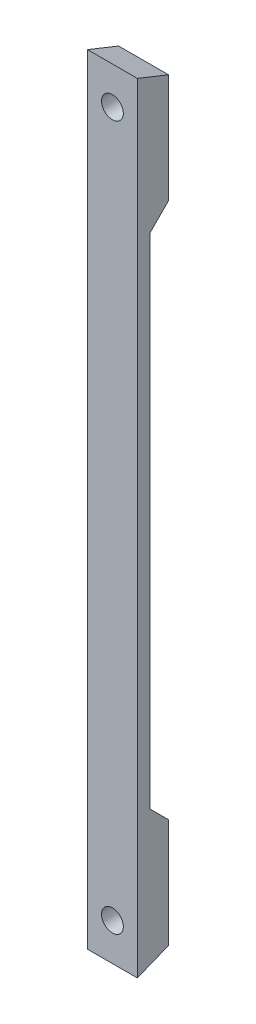
ISO-10303-21;
HEADER;
FILE_DESCRIPTION(('STEP AP214'),'2;1');
FILE_NAME('part.step','',(''),(''),'','','');
FILE_SCHEMA(('AUTOMOTIVE_DESIGN { 1 0 10303 214 1 1 1 1 }'));
ENDSEC;
DATA;
#1=APPLICATION_CONTEXT('core data for automotive mechanical design processes');
#2=APPLICATION_PROTOCOL_DEFINITION('international standard','automotive_design',2000,#1);
#3=PRODUCT_CONTEXT('',#1,'mechanical');
#4=PRODUCT('Part','Part','',(#3));
#5=PRODUCT_RELATED_PRODUCT_CATEGORY('part','',(#4));
#6=PRODUCT_DEFINITION_FORMATION('','',#4);
#7=PRODUCT_DEFINITION_CONTEXT('part definition',#1,'design');
#8=PRODUCT_DEFINITION('design','',#6,#7);
#9=PRODUCT_DEFINITION_SHAPE('','',#8);
#10=(LENGTH_UNIT() NAMED_UNIT(*) SI_UNIT(.MILLI.,.METRE.));
#11=(NAMED_UNIT(*) PLANE_ANGLE_UNIT() SI_UNIT($,.RADIAN.));
#12=(NAMED_UNIT(*) SI_UNIT($,.STERADIAN.) SOLID_ANGLE_UNIT());
#13=UNCERTAINTY_MEASURE_WITH_UNIT(LENGTH_MEASURE(1.E-05),#10,'distance_accuracy_value','');
#14=(GEOMETRIC_REPRESENTATION_CONTEXT(3) GLOBAL_UNCERTAINTY_ASSIGNED_CONTEXT((#13)) GLOBAL_UNIT_ASSIGNED_CONTEXT((#10,
#11,#12)) REPRESENTATION_CONTEXT('',''));
#15=CARTESIAN_POINT('',(0.,0.,0.));
#16=DIRECTION('',(0.,0.,1.));
#17=DIRECTION('',(1.,0.,0.));
#18=AXIS2_PLACEMENT_3D('',#15,#16,#17);
#19=CARTESIAN_POINT('',(0.,0.,0.));
#20=DIRECTION('',(0.,0.,1.));
#21=DIRECTION('',(1.,0.,0.));
#22=AXIS2_PLACEMENT_3D('',#19,#20,#21);
#23=PLANE('',#22);
#24=CARTESIAN_POINT('',(0.,-56.5,0.));
#25=DIRECTION('',(0.,0.,1.));
#26=DIRECTION('',(1.,0.,0.));
#27=AXIS2_PLACEMENT_3D('',#24,#25,#26);
#28=CIRCLE('',#27,3.75);
#29=CARTESIAN_POINT('',(3.75,-56.5,0.));
#30=VERTEX_POINT('',#29);
#31=EDGE_CURVE('E49',#30,#30,#28,.T.);
#32=ORIENTED_EDGE('',*,*,#31,.T.);
#33=EDGE_LOOP('',(#32));
#34=FACE_BOUND('',#33,.T.);
#35=DIRECTION('',(1.,0.,0.));
#36=VECTOR('',#35,1.);
#37=CARTESIAN_POINT('',(-4.00000000000001,-60.5,0.));
#38=LINE('',#37,#36);
#39=CARTESIAN_POINT('',(-4.00000000000001,-60.5,0.));
#40=VERTEX_POINT('',#39);
#41=CARTESIAN_POINT('',(4.00000000000001,-60.5,0.));
#42=VERTEX_POINT('',#41);
#43=EDGE_CURVE('E108',#40,#42,#38,.T.);
#44=ORIENTED_EDGE('',*,*,#43,.F.);
#45=DIRECTION('',(0.,-1.,0.));
#46=VECTOR('',#45,1.);
#47=CARTESIAN_POINT('',(-4.00000000000001,62.5,0.));
#48=LINE('',#47,#46);
#49=CARTESIAN_POINT('',(-4.00000000000001,-43.,0.));
#50=VERTEX_POINT('',#49);
#51=EDGE_CURVE('E124',#50,#40,#48,.T.);
#52=ORIENTED_EDGE('',*,*,#51,.F.);
#53=DIRECTION('',(1.,0.,0.));
#54=VECTOR('',#53,1.);
#55=CARTESIAN_POINT('',(-4.00000000000001,-43.,0.));
#56=LINE('',#55,#54);
#57=CARTESIAN_POINT('',(4.00000000000001,-43.,0.));
#58=VERTEX_POINT('',#57);
#59=EDGE_CURVE('E224',#50,#58,#56,.T.);
#60=ORIENTED_EDGE('',*,*,#59,.T.);
#61=DIRECTION('',(0.,1.,0.));
#62=VECTOR('',#61,1.);
#63=CARTESIAN_POINT('',(3.99999999999999,62.5,0.));
#64=LINE('',#63,#62);
#65=EDGE_CURVE('E123',#42,#58,#64,.T.);
#66=ORIENTED_EDGE('',*,*,#65,.F.);
#67=EDGE_LOOP('',(#44,#52,#60,#66));
#68=FACE_BOUND('',#67,.T.);
#69=ADVANCED_FACE('F41',(#34,#68),#23,.F.);
#70=CARTESIAN_POINT('',(0.,56.5,0.));
#71=DIRECTION('',(0.,0.,1.));
#72=DIRECTION('',(1.,0.,0.));
#73=AXIS2_PLACEMENT_3D('',#70,#71,#72);
#74=CIRCLE('',#73,3.75);
#75=CARTESIAN_POINT('',(3.75,56.5,0.));
#76=VERTEX_POINT('',#75);
#77=EDGE_CURVE('E136',#76,#76,#74,.T.);
#78=ORIENTED_EDGE('',*,*,#77,.T.);
#79=EDGE_LOOP('',(#78));
#80=FACE_BOUND('',#79,.T.);
#81=CARTESIAN_POINT('',(-4.00000000000001,60.5,0.));
#82=VERTEX_POINT('',#81);
#83=CARTESIAN_POINT('',(-4.00000000000002,43.,0.));
#84=VERTEX_POINT('',#83);
#85=EDGE_CURVE('E135',#82,#84,#48,.T.);
#86=ORIENTED_EDGE('',*,*,#85,.F.);
#87=DIRECTION('',(1.,0.,0.));
#88=VECTOR('',#87,1.);
#89=CARTESIAN_POINT('',(-4.00000000000002,60.5,0.));
#90=LINE('',#89,#88);
#91=CARTESIAN_POINT('',(3.99999999999999,60.5,0.));
#92=VERTEX_POINT('',#91);
#93=EDGE_CURVE('E64',#82,#92,#90,.T.);
#94=ORIENTED_EDGE('',*,*,#93,.T.);
#95=CARTESIAN_POINT('',(4.,43.,0.));
#96=VERTEX_POINT('',#95);
#97=EDGE_CURVE('E134',#96,#92,#64,.T.);
#98=ORIENTED_EDGE('',*,*,#97,.F.);
#99=DIRECTION('',(1.,0.,0.));
#100=VECTOR('',#99,1.);
#101=CARTESIAN_POINT('',(-4.00000000000002,43.,0.));
#102=LINE('',#101,#100);
#103=EDGE_CURVE('E210',#84,#96,#102,.T.);
#104=ORIENTED_EDGE('',*,*,#103,.F.);
#105=EDGE_LOOP('',(#86,#94,#98,#104));
#106=FACE_BOUND('',#105,.T.);
#107=ADVANCED_FACE('F157',(#80,#106),#23,.F.);
#108=CARTESIAN_POINT('',(-4.00000000000001,62.5,5.));
#109=DIRECTION('',(1.,0.,0.));
#110=DIRECTION('',(0.,1.,0.));
#111=AXIS2_PLACEMENT_3D('',#108,#109,#110);
#112=PLANE('',#111);
#113=DIRECTION('',(0.,0.371390676354104,0.928476690885259));
#114=VECTOR('',#113,1.);
#115=CARTESIAN_POINT('',(-4.00000000000002,52.1551724137931,-20.8620689655173));
#116=LINE('',#115,#114);
#117=CARTESIAN_POINT('',(-4.00000000000002,62.5,5.));
#118=VERTEX_POINT('',#117);
#119=EDGE_CURVE('E217',#82,#118,#116,.T.);
#120=ORIENTED_EDGE('',*,*,#119,.F.);
#121=ORIENTED_EDGE('',*,*,#85,.T.);
#122=DIRECTION('',(0.,0.707106781186548,-0.707106781186547));
#123=VECTOR('',#122,1.);
#124=CARTESIAN_POINT('',(-4.00000000000002,21.5,21.5));
#125=LINE('',#124,#123);
#126=CARTESIAN_POINT('',(-4.00000000000002,40.,3.));
#127=VERTEX_POINT('',#126);
#128=EDGE_CURVE('E233',#127,#84,#125,.T.);
#129=ORIENTED_EDGE('',*,*,#128,.F.);
#130=DIRECTION('',(0.,1.,0.));
#131=VECTOR('',#130,1.);
#132=CARTESIAN_POINT('',(-4.00000000000002,0.,3.));
#133=LINE('',#132,#131);
#134=CARTESIAN_POINT('',(-3.99999999999999,-40.,3.));
#135=VERTEX_POINT('',#134);
#136=EDGE_CURVE('E235',#135,#127,#133,.T.);
#137=ORIENTED_EDGE('',*,*,#136,.F.);
#138=DIRECTION('',(0.,0.707106781186548,0.707106781186547));
#139=VECTOR('',#138,1.);
#140=CARTESIAN_POINT('',(-4.00000000000001,-21.5,21.5));
#141=LINE('',#140,#139);
#142=EDGE_CURVE('E131',#50,#135,#141,.T.);
#143=ORIENTED_EDGE('',*,*,#142,.F.);
#144=ORIENTED_EDGE('',*,*,#51,.T.);
#145=DIRECTION('',(0.,0.371390676354104,-0.928476690885259));
#146=VECTOR('',#145,1.);
#147=CARTESIAN_POINT('',(-4.00000000000001,-52.1551724137931,-20.8620689655173));
#148=LINE('',#147,#146);
#149=CARTESIAN_POINT('',(-3.99999999999999,-62.5,5.));
#150=VERTEX_POINT('',#149);
#151=EDGE_CURVE('E106',#150,#40,#148,.T.);
#152=ORIENTED_EDGE('',*,*,#151,.F.);
#153=DIRECTION('',(0.,-1.,0.));
#154=VECTOR('',#153,1.);
#155=CARTESIAN_POINT('',(-4.00000000000001,62.5,5.));
#156=LINE('',#155,#154);
#157=EDGE_CURVE('E141',#118,#150,#156,.T.);
#158=ORIENTED_EDGE('',*,*,#157,.F.);
#159=EDGE_LOOP('',(#120,#121,#129,#137,#143,#144,#152,#158));
#160=FACE_BOUND('',#159,.T.);
#161=ADVANCED_FACE('F129',(#160),#112,.F.);
#162=CARTESIAN_POINT('',(0.,0.,5.));
#163=DIRECTION('',(0.,0.,1.));
#164=DIRECTION('',(1.,0.,0.));
#165=AXIS2_PLACEMENT_3D('',#162,#163,#164);
#166=PLANE('',#165);
#167=CARTESIAN_POINT('',(0.,-56.5,5.));
#168=DIRECTION('',(0.,0.,1.));
#169=DIRECTION('',(1.,0.,0.));
#170=AXIS2_PLACEMENT_3D('',#167,#168,#169);
#171=CIRCLE('',#170,1.75);
#172=CARTESIAN_POINT('',(1.75,-56.5,5.));
#173=VERTEX_POINT('',#172);
#174=EDGE_CURVE('E199',#173,#173,#171,.T.);
#175=ORIENTED_EDGE('',*,*,#174,.F.);
#176=EDGE_LOOP('',(#175));
#177=FACE_BOUND('',#176,.T.);
#178=DIRECTION('',(1.,0.,0.));
#179=VECTOR('',#178,1.);
#180=CARTESIAN_POINT('',(4.00000000000001,-62.5,5.));
#181=LINE('',#180,#179);
#182=CARTESIAN_POINT('',(4.00000000000001,-62.5,5.));
#183=VERTEX_POINT('',#182);
#184=EDGE_CURVE('E115',#150,#183,#181,.T.);
#185=ORIENTED_EDGE('',*,*,#184,.T.);
#186=DIRECTION('',(0.,1.,0.));
#187=VECTOR('',#186,1.);
#188=CARTESIAN_POINT('',(3.99999999999999,62.5,5.));
#189=LINE('',#188,#187);
#190=CARTESIAN_POINT('',(3.99999999999999,62.5,5.));
#191=VERTEX_POINT('',#190);
#192=EDGE_CURVE('E215',#183,#191,#189,.T.);
#193=ORIENTED_EDGE('',*,*,#192,.T.);
#194=DIRECTION('',(-1.,0.,0.));
#195=VECTOR('',#194,1.);
#196=CARTESIAN_POINT('',(3.99999999999999,62.5,5.));
#197=LINE('',#196,#195);
#198=EDGE_CURVE('E212',#191,#118,#197,.T.);
#199=ORIENTED_EDGE('',*,*,#198,.T.);
#200=ORIENTED_EDGE('',*,*,#157,.T.);
#201=EDGE_LOOP('',(#185,#193,#199,#200));
#202=FACE_BOUND('',#201,.T.);
#203=CARTESIAN_POINT('',(0.,56.5,5.));
#204=DIRECTION('',(0.,0.,1.));
#205=DIRECTION('',(1.,0.,0.));
#206=AXIS2_PLACEMENT_3D('',#203,#204,#205);
#207=CIRCLE('',#206,1.75);
#208=CARTESIAN_POINT('',(1.75,56.5,5.));
#209=VERTEX_POINT('',#208);
#210=EDGE_CURVE('E205',#209,#209,#207,.T.);
#211=ORIENTED_EDGE('',*,*,#210,.F.);
#212=EDGE_LOOP('',(#211));
#213=FACE_BOUND('',#212,.T.);
#214=ADVANCED_FACE('F169',(#177,#202,#213),#166,.T.);
#215=CARTESIAN_POINT('',(3.99999999999999,62.5,5.));
#216=DIRECTION('',(-1.,0.,0.));
#217=DIRECTION('',(0.,-1.,0.));
#218=AXIS2_PLACEMENT_3D('',#215,#216,#217);
#219=PLANE('',#218);
#220=ORIENTED_EDGE('',*,*,#97,.T.);
#221=DIRECTION('',(0.,0.371390676354104,0.928476690885259));
#222=VECTOR('',#221,1.);
#223=CARTESIAN_POINT('',(3.99999999999999,52.1551724137931,-20.8620689655173));
#224=LINE('',#223,#222);
#225=EDGE_CURVE('E191',#92,#191,#224,.T.);
#226=ORIENTED_EDGE('',*,*,#225,.T.);
#227=ORIENTED_EDGE('',*,*,#192,.F.);
#228=DIRECTION('',(0.,0.371390676354104,-0.928476690885259));
#229=VECTOR('',#228,1.);
#230=CARTESIAN_POINT('',(4.00000000000001,-52.1551724137931,-20.8620689655173));
#231=LINE('',#230,#229);
#232=EDGE_CURVE('E120',#183,#42,#231,.T.);
#233=ORIENTED_EDGE('',*,*,#232,.T.);
#234=ORIENTED_EDGE('',*,*,#65,.T.);
#235=DIRECTION('',(0.,0.707106781186548,0.707106781186547));
#236=VECTOR('',#235,1.);
#237=CARTESIAN_POINT('',(4.,-21.5,21.5));
#238=LINE('',#237,#236);
#239=CARTESIAN_POINT('',(4.00000000000001,-40.,3.));
#240=VERTEX_POINT('',#239);
#241=EDGE_CURVE('E230',#58,#240,#238,.T.);
#242=ORIENTED_EDGE('',*,*,#241,.T.);
#243=DIRECTION('',(0.,1.,0.));
#244=VECTOR('',#243,1.);
#245=CARTESIAN_POINT('',(4.,0.,3.));
#246=LINE('',#245,#244);
#247=CARTESIAN_POINT('',(4.,40.,3.));
#248=VERTEX_POINT('',#247);
#249=EDGE_CURVE('E239',#240,#248,#246,.T.);
#250=ORIENTED_EDGE('',*,*,#249,.T.);
#251=DIRECTION('',(0.,0.707106781186548,-0.707106781186547));
#252=VECTOR('',#251,1.);
#253=CARTESIAN_POINT('',(4.,21.5,21.5));
#254=LINE('',#253,#252);
#255=EDGE_CURVE('E127',#248,#96,#254,.T.);
#256=ORIENTED_EDGE('',*,*,#255,.T.);
#257=EDGE_LOOP('',(#220,#226,#227,#233,#234,#242,#250,#256));
#258=FACE_BOUND('',#257,.T.);
#259=ADVANCED_FACE('F175',(#258),#219,.F.);
#260=CARTESIAN_POINT('',(0.,-56.5,5.));
#261=DIRECTION('',(0.,0.,-1.));
#262=DIRECTION('',(-1.,0.,0.));
#263=AXIS2_PLACEMENT_3D('',#260,#261,#262);
#264=CYLINDRICAL_SURFACE('',#263,1.75);
#265=CARTESIAN_POINT('',(0.,-56.5,2.00000000000002));
#266=DIRECTION('',(0.,0.,1.));
#267=DIRECTION('',(1.,0.,0.));
#268=AXIS2_PLACEMENT_3D('',#265,#266,#267);
#269=CIRCLE('',#268,1.75);
#270=CARTESIAN_POINT('',(1.75,-56.5,2.00000000000002));
#271=VERTEX_POINT('',#270);
#272=EDGE_CURVE('E11',#271,#271,#269,.F.);
#273=ORIENTED_EDGE('',*,*,#272,.T.);
#274=EDGE_LOOP('',(#273));
#275=FACE_BOUND('',#274,.T.);
#276=ORIENTED_EDGE('',*,*,#174,.T.);
#277=EDGE_LOOP('',(#276));
#278=FACE_BOUND('',#277,.T.);
#279=ADVANCED_FACE('F173',(#275,#278),#264,.F.);
#280=CARTESIAN_POINT('',(0.,56.5,5.));
#281=DIRECTION('',(0.,0.,-1.));
#282=DIRECTION('',(-1.,0.,0.));
#283=AXIS2_PLACEMENT_3D('',#280,#281,#282);
#284=CYLINDRICAL_SURFACE('',#283,1.75);
#285=CARTESIAN_POINT('',(0.,56.5,2.00000000000002));
#286=DIRECTION('',(0.,0.,1.));
#287=DIRECTION('',(1.,0.,0.));
#288=AXIS2_PLACEMENT_3D('',#285,#286,#287);
#289=CIRCLE('',#288,1.75);
#290=CARTESIAN_POINT('',(1.75,56.5,2.00000000000002));
#291=VERTEX_POINT('',#290);
#292=EDGE_CURVE('E142',#291,#291,#289,.F.);
#293=ORIENTED_EDGE('',*,*,#292,.T.);
#294=EDGE_LOOP('',(#293));
#295=FACE_BOUND('',#294,.T.);
#296=ORIENTED_EDGE('',*,*,#210,.T.);
#297=EDGE_LOOP('',(#296));
#298=FACE_BOUND('',#297,.T.);
#299=ADVANCED_FACE('F186',(#295,#298),#284,.F.);
#300=CARTESIAN_POINT('',(-4.00000000000002,21.5,21.5));
#301=DIRECTION('',(0.,-0.707106781186547,-0.707106781186548));
#302=DIRECTION('',(0.,0.707106781186548,-0.707106781186547));
#303=AXIS2_PLACEMENT_3D('',#300,#301,#302);
#304=PLANE('',#303);
#305=ORIENTED_EDGE('',*,*,#255,.F.);
#306=DIRECTION('',(1.,0.,0.));
#307=VECTOR('',#306,1.);
#308=CARTESIAN_POINT('',(-4.00000000000002,40.,3.));
#309=LINE('',#308,#307);
#310=EDGE_CURVE('E229',#127,#248,#309,.T.);
#311=ORIENTED_EDGE('',*,*,#310,.F.);
#312=ORIENTED_EDGE('',*,*,#128,.T.);
#313=ORIENTED_EDGE('',*,*,#103,.T.);
#314=EDGE_LOOP('',(#305,#311,#312,#313));
#315=FACE_BOUND('',#314,.T.);
#316=ADVANCED_FACE('F243',(#315),#304,.T.);
#317=CARTESIAN_POINT('',(-4.00000000000001,-21.5,21.5));
#318=DIRECTION('',(0.,0.707106781186547,-0.707106781186548));
#319=DIRECTION('',(0.,0.707106781186548,0.707106781186547));
#320=AXIS2_PLACEMENT_3D('',#317,#318,#319);
#321=PLANE('',#320);
#322=ORIENTED_EDGE('',*,*,#241,.F.);
#323=ORIENTED_EDGE('',*,*,#59,.F.);
#324=ORIENTED_EDGE('',*,*,#142,.T.);
#325=DIRECTION('',(1.,0.,0.));
#326=VECTOR('',#325,1.);
#327=CARTESIAN_POINT('',(-4.00000000000001,-40.,3.));
#328=LINE('',#327,#326);
#329=EDGE_CURVE('E60',#135,#240,#328,.T.);
#330=ORIENTED_EDGE('',*,*,#329,.T.);
#331=EDGE_LOOP('',(#322,#323,#324,#330));
#332=FACE_BOUND('',#331,.T.);
#333=ADVANCED_FACE('F250',(#332),#321,.T.);
#334=CARTESIAN_POINT('',(-4.00000000000002,0.,3.));
#335=DIRECTION('',(0.,0.,-1.));
#336=DIRECTION('',(-1.,0.,0.));
#337=AXIS2_PLACEMENT_3D('',#334,#335,#336);
#338=PLANE('',#337);
#339=ORIENTED_EDGE('',*,*,#249,.F.);
#340=ORIENTED_EDGE('',*,*,#329,.F.);
#341=ORIENTED_EDGE('',*,*,#136,.T.);
#342=ORIENTED_EDGE('',*,*,#310,.T.);
#343=EDGE_LOOP('',(#339,#340,#341,#342));
#344=FACE_BOUND('',#343,.T.);
#345=ADVANCED_FACE('F244',(#344),#338,.T.);
#346=CARTESIAN_POINT('',(-4.00000000000001,-52.1551724137931,-20.8620689655173));
#347=DIRECTION('',(0.,-0.928476690885259,-0.371390676354104));
#348=DIRECTION('',(0.,0.371390676354104,-0.928476690885259));
#349=AXIS2_PLACEMENT_3D('',#346,#347,#348);
#350=PLANE('',#349);
#351=ORIENTED_EDGE('',*,*,#232,.F.);
#352=ORIENTED_EDGE('',*,*,#184,.F.);
#353=ORIENTED_EDGE('',*,*,#151,.T.);
#354=ORIENTED_EDGE('',*,*,#43,.T.);
#355=EDGE_LOOP('',(#351,#352,#353,#354));
#356=FACE_BOUND('',#355,.T.);
#357=ADVANCED_FACE('F107',(#356),#350,.T.);
#358=CARTESIAN_POINT('',(-4.00000000000002,52.1551724137931,-20.8620689655173));
#359=DIRECTION('',(0.,0.928476690885259,-0.371390676354104));
#360=DIRECTION('',(0.,0.371390676354104,0.928476690885259));
#361=AXIS2_PLACEMENT_3D('',#358,#359,#360);
#362=PLANE('',#361);
#363=ORIENTED_EDGE('',*,*,#225,.F.);
#364=ORIENTED_EDGE('',*,*,#93,.F.);
#365=ORIENTED_EDGE('',*,*,#119,.T.);
#366=ORIENTED_EDGE('',*,*,#198,.F.);
#367=EDGE_LOOP('',(#363,#364,#365,#366));
#368=FACE_BOUND('',#367,.T.);
#369=ADVANCED_FACE('F154',(#368),#362,.T.);
#370=CARTESIAN_POINT('',(0.,56.5,0.));
#371=DIRECTION('',(0.,0.,-1.));
#372=DIRECTION('',(-1.,0.,0.));
#373=AXIS2_PLACEMENT_3D('',#370,#371,#372);
#374=CONICAL_SURFACE('',#373,3.75,0.785398163397443);
#375=ORIENTED_EDGE('',*,*,#292,.F.);
#376=EDGE_LOOP('',(#375));
#377=FACE_BOUND('',#376,.T.);
#378=ORIENTED_EDGE('',*,*,#77,.F.);
#379=EDGE_LOOP('',(#378));
#380=FACE_BOUND('',#379,.T.);
#381=ADVANCED_FACE('F147',(#377,#380),#374,.F.);
#382=CARTESIAN_POINT('',(0.,-56.5,0.));
#383=DIRECTION('',(0.,0.,-1.));
#384=DIRECTION('',(-1.,0.,0.));
#385=AXIS2_PLACEMENT_3D('',#382,#383,#384);
#386=CONICAL_SURFACE('',#385,3.75,0.785398163397443);
#387=ORIENTED_EDGE('',*,*,#272,.F.);
#388=EDGE_LOOP('',(#387));
#389=FACE_BOUND('',#388,.T.);
#390=ORIENTED_EDGE('',*,*,#31,.F.);
#391=EDGE_LOOP('',(#390));
#392=FACE_BOUND('',#391,.T.);
#393=ADVANCED_FACE('F42',(#389,#392),#386,.F.);
#394=CLOSED_SHELL('',(#69,#107,#161,#214,#259,#279,#299,#316,#333,#345,#357,#369,#381,#393));
#395=MANIFOLD_SOLID_BREP('B2',#394);
#396=ADVANCED_BREP_SHAPE_REPRESENTATION('',(#18,#395),#14);
#397=SHAPE_DEFINITION_REPRESENTATION(#9,#396);
ENDSEC;
END-ISO-10303-21;
